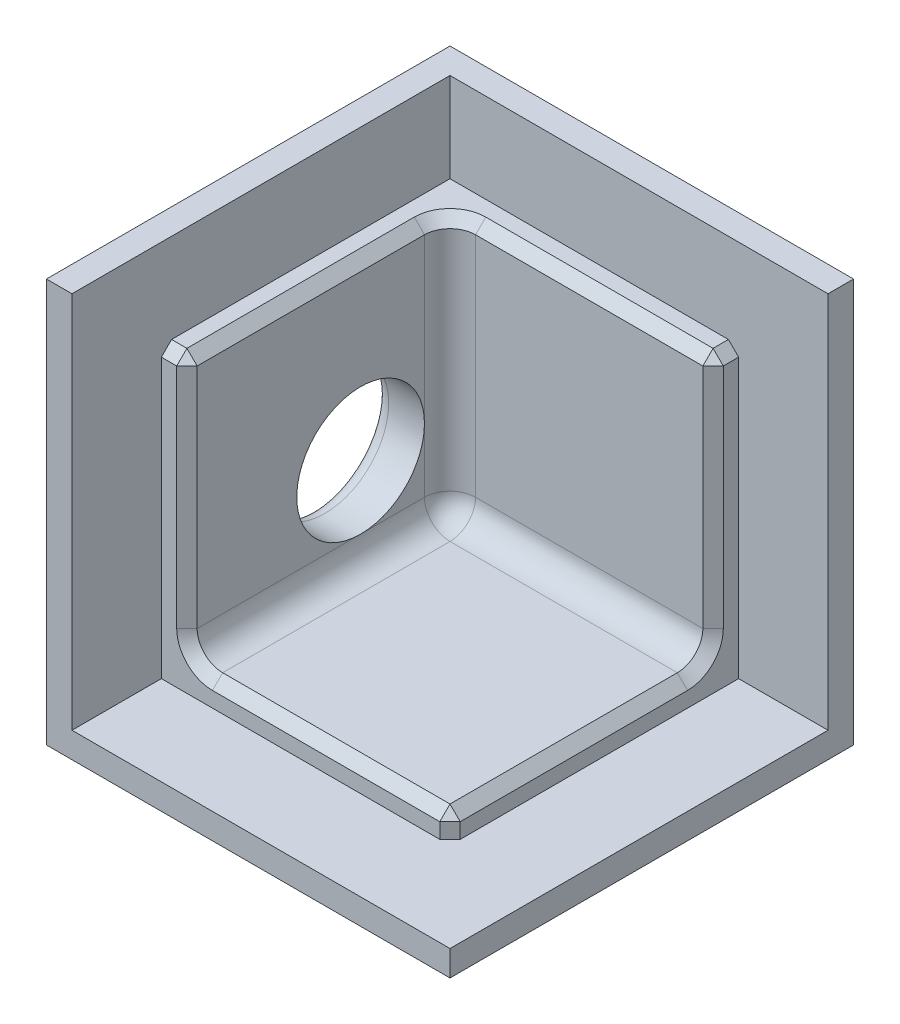
ISO-10303-21;
HEADER;
FILE_DESCRIPTION(('STEP AP214'),'2;1');
FILE_NAME('part.step','',(''),(''),'','','');
FILE_SCHEMA(('AUTOMOTIVE_DESIGN { 1 0 10303 214 1 1 1 1 }'));
ENDSEC;
DATA;
#1=APPLICATION_CONTEXT('core data for automotive mechanical design processes');
#2=APPLICATION_PROTOCOL_DEFINITION('international standard','automotive_design',2000,#1);
#3=PRODUCT_CONTEXT('',#1,'mechanical');
#4=PRODUCT('Part','Part','',(#3));
#5=PRODUCT_RELATED_PRODUCT_CATEGORY('part','',(#4));
#6=PRODUCT_DEFINITION_FORMATION('','',#4);
#7=PRODUCT_DEFINITION_CONTEXT('part definition',#1,'design');
#8=PRODUCT_DEFINITION('design','',#6,#7);
#9=PRODUCT_DEFINITION_SHAPE('','',#8);
#10=(LENGTH_UNIT() NAMED_UNIT(*) SI_UNIT(.MILLI.,.METRE.));
#11=(NAMED_UNIT(*) PLANE_ANGLE_UNIT() SI_UNIT($,.RADIAN.));
#12=(NAMED_UNIT(*) SI_UNIT($,.STERADIAN.) SOLID_ANGLE_UNIT());
#13=UNCERTAINTY_MEASURE_WITH_UNIT(LENGTH_MEASURE(1.E-05),#10,'distance_accuracy_value','');
#14=(GEOMETRIC_REPRESENTATION_CONTEXT(3) GLOBAL_UNCERTAINTY_ASSIGNED_CONTEXT((#13)) GLOBAL_UNIT_ASSIGNED_CONTEXT((#10,
#11,#12)) REPRESENTATION_CONTEXT('',''));
#15=CARTESIAN_POINT('',(0.,0.,0.));
#16=DIRECTION('',(0.,0.,1.));
#17=DIRECTION('',(1.,0.,0.));
#18=AXIS2_PLACEMENT_3D('',#15,#16,#17);
#19=CARTESIAN_POINT('',(-80.3971607088882,12.4102657004831,-7.89999999999997));
#20=DIRECTION('',(1.,0.,0.));
#21=DIRECTION('',(0.,0.,-1.));
#22=AXIS2_PLACEMENT_3D('',#19,#20,#21);
#23=PLANE('',#22);
#24=CARTESIAN_POINT('',(-80.3971607088882,2.1102657004831,-2.39999999999998));
#25=DIRECTION('',(1.,0.,0.));
#26=DIRECTION('',(0.,0.,-1.));
#27=AXIS2_PLACEMENT_3D('',#24,#25,#26);
#28=CIRCLE('',#27,2.5);
#29=CARTESIAN_POINT('',(-80.3971607088882,-0.389734299516903,-2.39999999999998));
#30=VERTEX_POINT('',#29);
#31=CARTESIAN_POINT('',(-80.3971607088882,2.1102657004831,-4.89999999999998));
#32=VERTEX_POINT('',#31);
#33=EDGE_CURVE('E48',#30,#32,#28,.F.);
#34=ORIENTED_EDGE('',*,*,#33,.T.);
#35=DIRECTION('',(0.,-1.,0.));
#36=VECTOR('',#35,1.);
#37=CARTESIAN_POINT('',(-80.3971607088882,8.9102657004831,-4.89999999999998));
#38=LINE('',#37,#36);
#39=CARTESIAN_POINT('',(-80.3971607088882,8.51026570048309,-4.89999999999998));
#40=VERTEX_POINT('',#39);
#41=EDGE_CURVE('E203',#32,#40,#38,.F.);
#42=ORIENTED_EDGE('',*,*,#41,.T.);
#43=DIRECTION('',(0.,0.,1.));
#44=VECTOR('',#43,1.);
#45=CARTESIAN_POINT('',(-80.3971607088882,8.51026570048309,4.40000000000003));
#46=LINE('',#45,#44);
#47=CARTESIAN_POINT('',(-80.3971607088882,8.51026570048309,4.00000000000002));
#48=VERTEX_POINT('',#47);
#49=EDGE_CURVE('E277',#40,#48,#46,.T.);
#50=ORIENTED_EDGE('',*,*,#49,.T.);
#51=DIRECTION('',(0.,-1.,0.));
#52=VECTOR('',#51,1.);
#53=CARTESIAN_POINT('',(-80.3971607088882,12.4102657004831,4.00000000000002));
#54=LINE('',#53,#52);
#55=CARTESIAN_POINT('',(-80.3971607088882,-0.389734299516903,4.00000000000002));
#56=VERTEX_POINT('',#55);
#57=EDGE_CURVE('E279',#48,#56,#54,.T.);
#58=ORIENTED_EDGE('',*,*,#57,.T.);
#59=DIRECTION('',(0.,0.,1.));
#60=VECTOR('',#59,1.);
#61=CARTESIAN_POINT('',(-80.3971607088882,-0.389734299516903,-5.89999999999998));
#62=LINE('',#61,#60);
#63=EDGE_CURVE('E206',#56,#30,#62,.F.);
#64=ORIENTED_EDGE('',*,*,#63,.T.);
#65=EDGE_LOOP('',(#34,#42,#50,#58,#64));
#66=FACE_BOUND('',#65,.T.);
#67=ADVANCED_FACE('F34',(#66),#23,.T.);
#68=CARTESIAN_POINT('',(-66.5971607088882,12.4102657004831,-7.89999999999997));
#69=DIRECTION('',(-1.,0.,0.));
#70=DIRECTION('',(0.,0.,1.));
#71=AXIS2_PLACEMENT_3D('',#68,#69,#70);
#72=PLANE('',#71);
#73=DIRECTION('',(0.,1.,0.));
#74=VECTOR('',#73,1.);
#75=CARTESIAN_POINT('',(-66.5971607088882,8.9102657004831,-6.89999999999998));
#76=LINE('',#75,#74);
#77=CARTESIAN_POINT('',(-66.5971607088882,-2.3897342995169,-6.89999999999998));
#78=VERTEX_POINT('',#77);
#79=CARTESIAN_POINT('',(-66.5971607088882,12.4102657004831,-6.89999999999998));
#80=VERTEX_POINT('',#79);
#81=EDGE_CURVE('E538',#78,#80,#76,.T.);
#82=ORIENTED_EDGE('',*,*,#81,.F.);
#83=DIRECTION('',(0.,0.,1.));
#84=VECTOR('',#83,1.);
#85=CARTESIAN_POINT('',(-66.5971607088882,-2.3897342995169,4.40000000000003));
#86=LINE('',#85,#84);
#87=CARTESIAN_POINT('',(-66.5971607088882,-2.3897342995169,7.90000000000003));
#88=VERTEX_POINT('',#87);
#89=EDGE_CURVE('E555',#78,#88,#86,.T.);
#90=ORIENTED_EDGE('',*,*,#89,.T.);
#91=DIRECTION('',(0.,-1.,0.));
#92=VECTOR('',#91,1.);
#93=CARTESIAN_POINT('',(-66.5971607088882,12.4102657004831,7.90000000000003));
#94=LINE('',#93,#92);
#95=CARTESIAN_POINT('',(-66.5971607088882,-3.3897342995169,7.90000000000003));
#96=VERTEX_POINT('',#95);
#97=EDGE_CURVE('E572',#88,#96,#94,.T.);
#98=ORIENTED_EDGE('',*,*,#97,.T.);
#99=DIRECTION('',(0.,0.,-1.));
#100=VECTOR('',#99,1.);
#101=CARTESIAN_POINT('',(-66.5971607088882,-3.3897342995169,-7.89999999999997));
#102=LINE('',#101,#100);
#103=CARTESIAN_POINT('',(-66.5971607088882,-3.3897342995169,-7.89999999999997));
#104=VERTEX_POINT('',#103);
#105=EDGE_CURVE('E558',#96,#104,#102,.T.);
#106=ORIENTED_EDGE('',*,*,#105,.T.);
#107=DIRECTION('',(0.,-1.,0.));
#108=VECTOR('',#107,1.);
#109=CARTESIAN_POINT('',(-66.5971607088882,12.4102657004831,-7.89999999999997));
#110=LINE('',#109,#108);
#111=CARTESIAN_POINT('',(-66.5971607088882,12.4102657004831,-7.89999999999997));
#112=VERTEX_POINT('',#111);
#113=EDGE_CURVE('E588',#112,#104,#110,.T.);
#114=ORIENTED_EDGE('',*,*,#113,.F.);
#115=DIRECTION('',(0.,0.,-1.));
#116=VECTOR('',#115,1.);
#117=CARTESIAN_POINT('',(-66.5971607088882,12.4102657004831,-7.89999999999997));
#118=LINE('',#117,#116);
#119=EDGE_CURVE('E562',#80,#112,#118,.T.);
#120=ORIENTED_EDGE('',*,*,#119,.F.);
#121=EDGE_LOOP('',(#82,#90,#98,#106,#114,#120));
#122=FACE_BOUND('',#121,.T.);
#123=ADVANCED_FACE('F346',(#122),#72,.F.);
#124=EDGE_CURVE('E193',#32,#30,#28,.F.);
#125=ORIENTED_EDGE('',*,*,#124,.T.);
#126=CARTESIAN_POINT('',(-80.3971607088882,-0.389734299516903,-4.89999999999998));
#127=VERTEX_POINT('',#126);
#128=EDGE_CURVE('E219',#30,#127,#62,.F.);
#129=ORIENTED_EDGE('',*,*,#128,.T.);
#130=EDGE_CURVE('E212',#127,#32,#38,.F.);
#131=ORIENTED_EDGE('',*,*,#130,.T.);
#132=EDGE_LOOP('',(#125,#129,#131));
#133=FACE_BOUND('',#132,.T.);
#134=ADVANCED_FACE('F218',(#133),#23,.T.);
#135=CARTESIAN_POINT('',(-74.4971607088882,-1.3897342995169,0.));
#136=DIRECTION('',(0.,1.,0.));
#137=DIRECTION('',(0.,0.,1.));
#138=AXIS2_PLACEMENT_3D('',#135,#136,#137);
#139=PLANE('',#138);
#140=DIRECTION('',(0.,0.,1.));
#141=VECTOR('',#140,1.);
#142=CARTESIAN_POINT('',(-79.3971607088882,-1.3897342995169,4.40000000000003));
#143=LINE('',#142,#141);
#144=CARTESIAN_POINT('',(-79.3971607088882,-1.3897342995169,-4.89999999999998));
#145=VERTEX_POINT('',#144);
#146=CARTESIAN_POINT('',(-79.3971607088882,-1.3897342995169,4.00000000000002));
#147=VERTEX_POINT('',#146);
#148=EDGE_CURVE('E221',#145,#147,#143,.T.);
#149=ORIENTED_EDGE('',*,*,#148,.T.);
#150=DIRECTION('',(1.,0.,0.));
#151=VECTOR('',#150,1.);
#152=CARTESIAN_POINT('',(-74.4971607088882,-1.3897342995169,4.00000000000002));
#153=LINE('',#152,#151);
#154=CARTESIAN_POINT('',(-70.4971607088882,-1.3897342995169,4.00000000000002));
#155=VERTEX_POINT('',#154);
#156=EDGE_CURVE('E262',#147,#155,#153,.T.);
#157=ORIENTED_EDGE('',*,*,#156,.T.);
#158=DIRECTION('',(0.,0.,-1.));
#159=VECTOR('',#158,1.);
#160=CARTESIAN_POINT('',(-70.4971607088882,-1.3897342995169,-4.89999999999998));
#161=LINE('',#160,#159);
#162=CARTESIAN_POINT('',(-70.4971607088882,-1.3897342995169,-4.89999999999998));
#163=VERTEX_POINT('',#162);
#164=EDGE_CURVE('E260',#155,#163,#161,.T.);
#165=ORIENTED_EDGE('',*,*,#164,.T.);
#166=DIRECTION('',(-1.,0.,0.));
#167=VECTOR('',#166,1.);
#168=CARTESIAN_POINT('',(-80.3971607088882,-1.3897342995169,-4.89999999999998));
#169=LINE('',#168,#167);
#170=EDGE_CURVE('E223',#163,#145,#169,.T.);
#171=ORIENTED_EDGE('',*,*,#170,.T.);
#172=EDGE_LOOP('',(#149,#157,#165,#171));
#173=FACE_BOUND('',#172,.T.);
#174=ADVANCED_FACE('F356',(#173),#139,.T.);
#175=CARTESIAN_POINT('',(-82.3971607088882,12.4102657004831,7.90000000000003));
#176=DIRECTION('',(0.,0.,-1.));
#177=DIRECTION('',(-1.,0.,0.));
#178=AXIS2_PLACEMENT_3D('',#175,#176,#177);
#179=PLANE('',#178);
#180=ORIENTED_EDGE('',*,*,#97,.F.);
#181=DIRECTION('',(1.,0.,0.));
#182=VECTOR('',#181,1.);
#183=CARTESIAN_POINT('',(-81.3971607088882,-2.3897342995169,7.90000000000003));
#184=LINE('',#183,#182);
#185=CARTESIAN_POINT('',(-81.3971607088882,-2.3897342995169,7.90000000000003));
#186=VERTEX_POINT('',#185);
#187=EDGE_CURVE('E548',#186,#88,#184,.T.);
#188=ORIENTED_EDGE('',*,*,#187,.F.);
#189=DIRECTION('',(0.,-1.,0.));
#190=VECTOR('',#189,1.);
#191=CARTESIAN_POINT('',(-81.3971607088882,12.4102657004831,7.90000000000003));
#192=LINE('',#191,#190);
#193=CARTESIAN_POINT('',(-81.3971607088882,12.4102657004831,7.90000000000003));
#194=VERTEX_POINT('',#193);
#195=EDGE_CURVE('E543',#194,#186,#192,.T.);
#196=ORIENTED_EDGE('',*,*,#195,.F.);
#197=DIRECTION('',(1.,0.,0.));
#198=VECTOR('',#197,1.);
#199=CARTESIAN_POINT('',(-82.3971607088882,12.4102657004831,7.90000000000003));
#200=LINE('',#199,#198);
#201=CARTESIAN_POINT('',(-82.3971607088882,12.4102657004831,7.90000000000003));
#202=VERTEX_POINT('',#201);
#203=EDGE_CURVE('E569',#202,#194,#200,.T.);
#204=ORIENTED_EDGE('',*,*,#203,.F.);
#205=DIRECTION('',(0.,-1.,0.));
#206=VECTOR('',#205,1.);
#207=CARTESIAN_POINT('',(-82.3971607088882,12.4102657004831,7.90000000000003));
#208=LINE('',#207,#206);
#209=CARTESIAN_POINT('',(-82.3971607088882,-3.3897342995169,7.90000000000003));
#210=VERTEX_POINT('',#209);
#211=EDGE_CURVE('E582',#202,#210,#208,.T.);
#212=ORIENTED_EDGE('',*,*,#211,.T.);
#213=DIRECTION('',(1.,0.,0.));
#214=VECTOR('',#213,1.);
#215=CARTESIAN_POINT('',(-82.3971607088882,-3.3897342995169,7.90000000000003));
#216=LINE('',#215,#214);
#217=EDGE_CURVE('E565',#210,#96,#216,.T.);
#218=ORIENTED_EDGE('',*,*,#217,.T.);
#219=EDGE_LOOP('',(#180,#188,#196,#204,#212,#218));
#220=FACE_BOUND('',#219,.T.);
#221=ADVANCED_FACE('F360',(#220),#179,.F.);
#222=CARTESIAN_POINT('',(-82.3971607088882,12.4102657004831,-7.89999999999997));
#223=DIRECTION('',(0.,0.,1.));
#224=DIRECTION('',(1.,0.,0.));
#225=AXIS2_PLACEMENT_3D('',#222,#223,#224);
#226=PLANE('',#225);
#227=DIRECTION('',(-1.,0.,0.));
#228=VECTOR('',#227,1.);
#229=CARTESIAN_POINT('',(-82.3971607088882,-3.3897342995169,-7.89999999999997));
#230=LINE('',#229,#228);
#231=CARTESIAN_POINT('',(-82.3971607088882,-3.3897342995169,-7.89999999999997));
#232=VERTEX_POINT('',#231);
#233=EDGE_CURVE('E575',#104,#232,#230,.T.);
#234=ORIENTED_EDGE('',*,*,#233,.T.);
#235=DIRECTION('',(0.,-1.,0.));
#236=VECTOR('',#235,1.);
#237=CARTESIAN_POINT('',(-82.3971607088882,12.4102657004831,-7.89999999999997));
#238=LINE('',#237,#236);
#239=CARTESIAN_POINT('',(-82.3971607088882,12.4102657004831,-7.89999999999997));
#240=VERTEX_POINT('',#239);
#241=EDGE_CURVE('E585',#240,#232,#238,.T.);
#242=ORIENTED_EDGE('',*,*,#241,.F.);
#243=DIRECTION('',(-1.,0.,0.));
#244=VECTOR('',#243,1.);
#245=CARTESIAN_POINT('',(-82.3971607088882,12.4102657004831,-7.89999999999997));
#246=LINE('',#245,#244);
#247=EDGE_CURVE('E564',#112,#240,#246,.T.);
#248=ORIENTED_EDGE('',*,*,#247,.F.);
#249=ORIENTED_EDGE('',*,*,#113,.T.);
#250=EDGE_LOOP('',(#234,#242,#248,#249));
#251=FACE_BOUND('',#250,.T.);
#252=ADVANCED_FACE('F365',(#251),#226,.F.);
#253=CARTESIAN_POINT('',(-82.3971607088882,12.4102657004831,-7.89999999999997));
#254=DIRECTION('',(1.,0.,0.));
#255=DIRECTION('',(0.,0.,-1.));
#256=AXIS2_PLACEMENT_3D('',#253,#254,#255);
#257=PLANE('',#256);
#258=CARTESIAN_POINT('',(-82.3971607088882,2.1102657004831,-2.39999999999998));
#259=DIRECTION('',(1.,0.,0.));
#260=DIRECTION('',(0.,0.,-1.));
#261=AXIS2_PLACEMENT_3D('',#258,#259,#260);
#262=CIRCLE('',#261,3.1);
#263=CARTESIAN_POINT('',(-82.3971607088882,2.1102657004831,-5.49999999999998));
#264=VERTEX_POINT('',#263);
#265=EDGE_CURVE('E11',#264,#264,#262,.T.);
#266=ORIENTED_EDGE('',*,*,#265,.T.);
#267=EDGE_LOOP('',(#266));
#268=FACE_BOUND('',#267,.T.);
#269=DIRECTION('',(0.,0.,1.));
#270=VECTOR('',#269,1.);
#271=CARTESIAN_POINT('',(-82.3971607088882,-3.3897342995169,-7.89999999999997));
#272=LINE('',#271,#270);
#273=EDGE_CURVE('E577',#232,#210,#272,.T.);
#274=ORIENTED_EDGE('',*,*,#273,.T.);
#275=ORIENTED_EDGE('',*,*,#211,.F.);
#276=DIRECTION('',(0.,0.,1.));
#277=VECTOR('',#276,1.);
#278=CARTESIAN_POINT('',(-82.3971607088882,12.4102657004831,-7.89999999999997));
#279=LINE('',#278,#277);
#280=EDGE_CURVE('E567',#240,#202,#279,.T.);
#281=ORIENTED_EDGE('',*,*,#280,.F.);
#282=ORIENTED_EDGE('',*,*,#241,.T.);
#283=EDGE_LOOP('',(#274,#275,#281,#282));
#284=FACE_BOUND('',#283,.T.);
#285=ADVANCED_FACE('F373',(#268,#284),#257,.F.);
#286=CARTESIAN_POINT('',(-74.4971607088882,12.4102657004831,0.));
#287=DIRECTION('',(0.,1.,0.));
#288=DIRECTION('',(0.,0.,1.));
#289=AXIS2_PLACEMENT_3D('',#286,#287,#288);
#290=PLANE('',#289);
#291=DIRECTION('',(0.,0.,1.));
#292=VECTOR('',#291,1.);
#293=CARTESIAN_POINT('',(-81.3971607088882,12.4102657004831,4.40000000000003));
#294=LINE('',#293,#292);
#295=CARTESIAN_POINT('',(-81.3971607088882,12.4102657004831,-6.89999999999998));
#296=VERTEX_POINT('',#295);
#297=EDGE_CURVE('E551',#296,#194,#294,.T.);
#298=ORIENTED_EDGE('',*,*,#297,.F.);
#299=DIRECTION('',(-1.,0.,0.));
#300=VECTOR('',#299,1.);
#301=CARTESIAN_POINT('',(-81.3971607088882,12.4102657004831,-6.89999999999998));
#302=LINE('',#301,#300);
#303=EDGE_CURVE('E531',#80,#296,#302,.T.);
#304=ORIENTED_EDGE('',*,*,#303,.F.);
#305=ORIENTED_EDGE('',*,*,#119,.T.);
#306=ORIENTED_EDGE('',*,*,#247,.T.);
#307=ORIENTED_EDGE('',*,*,#280,.T.);
#308=ORIENTED_EDGE('',*,*,#203,.T.);
#309=EDGE_LOOP('',(#298,#304,#305,#306,#307,#308));
#310=FACE_BOUND('',#309,.T.);
#311=ADVANCED_FACE('F369',(#310),#290,.T.);
#312=CARTESIAN_POINT('',(-74.4971607088882,-3.3897342995169,0.));
#313=DIRECTION('',(0.,1.,0.));
#314=DIRECTION('',(0.,0.,1.));
#315=AXIS2_PLACEMENT_3D('',#312,#313,#314);
#316=PLANE('',#315);
#317=ORIENTED_EDGE('',*,*,#105,.F.);
#318=ORIENTED_EDGE('',*,*,#217,.F.);
#319=ORIENTED_EDGE('',*,*,#273,.F.);
#320=ORIENTED_EDGE('',*,*,#233,.F.);
#321=EDGE_LOOP('',(#317,#318,#319,#320));
#322=FACE_BOUND('',#321,.T.);
#323=ADVANCED_FACE('F372',(#322),#316,.F.);
#324=CARTESIAN_POINT('',(-82.3971607088882,12.4102657004831,-5.89999999999998));
#325=DIRECTION('',(0.,0.,1.));
#326=DIRECTION('',(1.,0.,0.));
#327=AXIS2_PLACEMENT_3D('',#324,#325,#326);
#328=PLANE('',#327);
#329=DIRECTION('',(-1.,0.,0.));
#330=VECTOR('',#329,1.);
#331=CARTESIAN_POINT('',(-70.0971607088882,-0.389734299516903,-5.89999999999998));
#332=LINE('',#331,#330);
#333=CARTESIAN_POINT('',(-79.3971607088882,-0.389734299516903,-5.89999999999998));
#334=VERTEX_POINT('',#333);
#335=CARTESIAN_POINT('',(-70.4971607088882,-0.389734299516903,-5.89999999999998));
#336=VERTEX_POINT('',#335);
#337=EDGE_CURVE('E591',#334,#336,#332,.F.);
#338=ORIENTED_EDGE('',*,*,#337,.T.);
#339=DIRECTION('',(0.,1.,0.));
#340=VECTOR('',#339,1.);
#341=CARTESIAN_POINT('',(-70.4971607088882,8.9102657004831,-5.89999999999998));
#342=LINE('',#341,#340);
#343=CARTESIAN_POINT('',(-70.4971607088882,8.51026570048309,-5.89999999999998));
#344=VERTEX_POINT('',#343);
#345=EDGE_CURVE('E56',#336,#344,#342,.T.);
#346=ORIENTED_EDGE('',*,*,#345,.T.);
#347=DIRECTION('',(-1.,0.,0.));
#348=VECTOR('',#347,1.);
#349=CARTESIAN_POINT('',(-79.3971607088882,8.51026570048309,-5.89999999999998));
#350=LINE('',#349,#348);
#351=CARTESIAN_POINT('',(-79.3971607088882,8.51026570048309,-5.89999999999998));
#352=VERTEX_POINT('',#351);
#353=EDGE_CURVE('E284',#344,#352,#350,.T.);
#354=ORIENTED_EDGE('',*,*,#353,.T.);
#355=DIRECTION('',(0.,-1.,0.));
#356=VECTOR('',#355,1.);
#357=CARTESIAN_POINT('',(-79.3971607088882,-1.3897342995169,-5.89999999999998));
#358=LINE('',#357,#356);
#359=EDGE_CURVE('E592',#352,#334,#358,.T.);
#360=ORIENTED_EDGE('',*,*,#359,.T.);
#361=EDGE_LOOP('',(#338,#346,#354,#360));
#362=FACE_BOUND('',#361,.T.);
#363=ADVANCED_FACE('F376',(#362),#328,.T.);
#364=CARTESIAN_POINT('',(-81.3971607088882,-2.3897342995169,4.40000000000003));
#365=DIRECTION('',(0.,-1.,0.));
#366=DIRECTION('',(0.,0.,-1.));
#367=AXIS2_PLACEMENT_3D('',#364,#365,#366);
#368=PLANE('',#367);
#369=ORIENTED_EDGE('',*,*,#187,.T.);
#370=ORIENTED_EDGE('',*,*,#89,.F.);
#371=DIRECTION('',(-1.,0.,0.));
#372=VECTOR('',#371,1.);
#373=CARTESIAN_POINT('',(-15.1391572594028,-2.3897342995169,-6.89999999999999));
#374=LINE('',#373,#372);
#375=CARTESIAN_POINT('',(-70.0971607088882,-2.3897342995169,-6.89999999999997));
#376=VERTEX_POINT('',#375);
#377=EDGE_CURVE('E529',#78,#376,#374,.T.);
#378=ORIENTED_EDGE('',*,*,#377,.T.);
#379=DIRECTION('',(0.,0.,1.));
#380=VECTOR('',#379,1.);
#381=CARTESIAN_POINT('',(-70.0971607088882,-2.3897342995169,4.40000000000003));
#382=LINE('',#381,#380);
#383=CARTESIAN_POINT('',(-70.0971607088882,-2.3897342995169,4.00000000000002));
#384=VERTEX_POINT('',#383);
#385=EDGE_CURVE('E239',#376,#384,#382,.T.);
#386=ORIENTED_EDGE('',*,*,#385,.T.);
#387=DIRECTION('',(-0.707106781186544,0.,0.707106781186551));
#388=VECTOR('',#387,1.);
#389=CARTESIAN_POINT('',(-75.9471607088881,-2.3897342995169,9.85000000000003));
#390=LINE('',#389,#388);
#391=CARTESIAN_POINT('',(-70.4971607088882,-2.3897342995169,4.40000000000003));
#392=VERTEX_POINT('',#391);
#393=EDGE_CURVE('E287',#384,#392,#390,.T.);
#394=ORIENTED_EDGE('',*,*,#393,.T.);
#395=DIRECTION('',(1.,0.,0.));
#396=VECTOR('',#395,1.);
#397=CARTESIAN_POINT('',(-81.3971607088882,-2.3897342995169,4.40000000000003));
#398=LINE('',#397,#396);
#399=CARTESIAN_POINT('',(-81.3971607088882,-2.3897342995169,4.40000000000003));
#400=VERTEX_POINT('',#399);
#401=EDGE_CURVE('E547',#400,#392,#398,.T.);
#402=ORIENTED_EDGE('',*,*,#401,.F.);
#403=DIRECTION('',(0.,0.,1.));
#404=VECTOR('',#403,1.);
#405=CARTESIAN_POINT('',(-81.3971607088882,-2.3897342995169,4.40000000000003));
#406=LINE('',#405,#404);
#407=EDGE_CURVE('E559',#400,#186,#406,.T.);
#408=ORIENTED_EDGE('',*,*,#407,.T.);
#409=EDGE_LOOP('',(#369,#370,#378,#386,#394,#402,#408));
#410=FACE_BOUND('',#409,.T.);
#411=ADVANCED_FACE('F608',(#410),#368,.F.);
#412=CARTESIAN_POINT('',(-81.3971607088882,12.4102657004831,4.40000000000003));
#413=DIRECTION('',(-1.,0.,0.));
#414=DIRECTION('',(0.,-1.,0.));
#415=AXIS2_PLACEMENT_3D('',#412,#413,#414);
#416=PLANE('',#415);
#417=ORIENTED_EDGE('',*,*,#195,.T.);
#418=ORIENTED_EDGE('',*,*,#407,.F.);
#419=DIRECTION('',(0.,-1.,0.));
#420=VECTOR('',#419,1.);
#421=CARTESIAN_POINT('',(-81.3971607088882,12.4102657004831,4.40000000000003));
#422=LINE('',#421,#420);
#423=CARTESIAN_POINT('',(-81.3971607088882,8.51026570048309,4.40000000000003));
#424=VERTEX_POINT('',#423);
#425=EDGE_CURVE('E545',#424,#400,#422,.T.);
#426=ORIENTED_EDGE('',*,*,#425,.F.);
#427=DIRECTION('',(0.,0.707106781186548,-0.707106781186548));
#428=VECTOR('',#427,1.);
#429=CARTESIAN_POINT('',(-81.3971607088882,10.4602657004831,2.45000000000002));
#430=LINE('',#429,#428);
#431=CARTESIAN_POINT('',(-81.3971607088882,8.9102657004831,4.00000000000002));
#432=VERTEX_POINT('',#431);
#433=EDGE_CURVE('E289',#424,#432,#430,.T.);
#434=ORIENTED_EDGE('',*,*,#433,.T.);
#435=DIRECTION('',(0.,0.,1.));
#436=VECTOR('',#435,1.);
#437=CARTESIAN_POINT('',(-81.3971607088882,8.9102657004831,4.40000000000003));
#438=LINE('',#437,#436);
#439=CARTESIAN_POINT('',(-81.3971607088882,8.9102657004831,-6.89999999999998));
#440=VERTEX_POINT('',#439);
#441=EDGE_CURVE('E536',#440,#432,#438,.T.);
#442=ORIENTED_EDGE('',*,*,#441,.F.);
#443=DIRECTION('',(0.,1.,0.));
#444=VECTOR('',#443,1.);
#445=CARTESIAN_POINT('',(-81.3971607088882,8.9102657004831,-6.89999999999998));
#446=LINE('',#445,#444);
#447=EDGE_CURVE('E540',#440,#296,#446,.T.);
#448=ORIENTED_EDGE('',*,*,#447,.T.);
#449=ORIENTED_EDGE('',*,*,#297,.T.);
#450=EDGE_LOOP('',(#417,#418,#426,#434,#442,#448,#449));
#451=FACE_BOUND('',#450,.T.);
#452=ADVANCED_FACE('F620',(#451),#416,.F.);
#453=CARTESIAN_POINT('',(-74.4971607088882,-3.3897342995169,4.40000000000003));
#454=DIRECTION('',(0.,0.,1.));
#455=DIRECTION('',(1.,0.,0.));
#456=AXIS2_PLACEMENT_3D('',#453,#454,#455);
#457=PLANE('',#456);
#458=ORIENTED_EDGE('',*,*,#401,.T.);
#459=DIRECTION('',(0.,1.,0.));
#460=VECTOR('',#459,1.);
#461=CARTESIAN_POINT('',(-70.4971607088882,-1.3897342995169,4.40000000000003));
#462=LINE('',#461,#460);
#463=CARTESIAN_POINT('',(-70.4971607088882,-1.78973429951691,4.40000000000003));
#464=VERTEX_POINT('',#463);
#465=EDGE_CURVE('E247',#392,#464,#462,.T.);
#466=ORIENTED_EDGE('',*,*,#465,.T.);
#467=DIRECTION('',(-1.,0.,0.));
#468=VECTOR('',#467,1.);
#469=CARTESIAN_POINT('',(-74.4971607088882,-1.78973429951691,4.40000000000003));
#470=LINE('',#469,#468);
#471=CARTESIAN_POINT('',(-79.3971607088882,-1.78973429951691,4.40000000000003));
#472=VERTEX_POINT('',#471);
#473=EDGE_CURVE('E245',#464,#472,#470,.T.);
#474=ORIENTED_EDGE('',*,*,#473,.T.);
#475=CARTESIAN_POINT('',(-79.3971607088882,-0.389734299516903,4.40000000000003));
#476=DIRECTION('',(0.,0.,1.));
#477=DIRECTION('',(1.,0.,0.));
#478=AXIS2_PLACEMENT_3D('',#475,#476,#477);
#479=CIRCLE('',#478,1.4);
#480=CARTESIAN_POINT('',(-80.7971607088882,-0.389734299516903,4.40000000000003));
#481=VERTEX_POINT('',#480);
#482=EDGE_CURVE('E243',#472,#481,#479,.F.);
#483=ORIENTED_EDGE('',*,*,#482,.T.);
#484=DIRECTION('',(0.,1.,0.));
#485=VECTOR('',#484,1.);
#486=CARTESIAN_POINT('',(-80.7971607088882,-3.3897342995169,4.40000000000003));
#487=LINE('',#486,#485);
#488=CARTESIAN_POINT('',(-80.7971607088882,8.51026570048309,4.40000000000003));
#489=VERTEX_POINT('',#488);
#490=EDGE_CURVE('E229',#481,#489,#487,.T.);
#491=ORIENTED_EDGE('',*,*,#490,.T.);
#492=DIRECTION('',(-1.,0.,0.));
#493=VECTOR('',#492,1.);
#494=CARTESIAN_POINT('',(-81.3971607088882,8.51026570048309,4.40000000000003));
#495=LINE('',#494,#493);
#496=EDGE_CURVE('E241',#489,#424,#495,.T.);
#497=ORIENTED_EDGE('',*,*,#496,.T.);
#498=ORIENTED_EDGE('',*,*,#425,.T.);
#499=EDGE_LOOP('',(#458,#466,#474,#483,#491,#497,#498));
#500=FACE_BOUND('',#499,.T.);
#501=ADVANCED_FACE('F612',(#500),#457,.T.);
#502=CARTESIAN_POINT('',(-81.3971607088882,8.9102657004831,-6.89999999999998));
#503=DIRECTION('',(0.,0.,-1.));
#504=DIRECTION('',(-1.,0.,0.));
#505=AXIS2_PLACEMENT_3D('',#502,#503,#504);
#506=PLANE('',#505);
#507=ORIENTED_EDGE('',*,*,#303,.T.);
#508=ORIENTED_EDGE('',*,*,#447,.F.);
#509=DIRECTION('',(-1.,0.,0.));
#510=VECTOR('',#509,1.);
#511=CARTESIAN_POINT('',(-81.3971607088882,8.9102657004831,-6.89999999999998));
#512=LINE('',#511,#510);
#513=CARTESIAN_POINT('',(-70.4971607088882,8.9102657004831,-6.89999999999998));
#514=VERTEX_POINT('',#513);
#515=EDGE_CURVE('E525',#514,#440,#512,.T.);
#516=ORIENTED_EDGE('',*,*,#515,.F.);
#517=DIRECTION('',(-0.707106781186548,0.707106781186548,0.));
#518=VECTOR('',#517,1.);
#519=CARTESIAN_POINT('',(-75.9471607088882,14.3602657004831,-6.89999999999998));
#520=LINE('',#519,#518);
#521=CARTESIAN_POINT('',(-70.0971607088882,8.51026570048309,-6.89999999999997));
#522=VERTEX_POINT('',#521);
#523=EDGE_CURVE('E291',#514,#522,#520,.F.);
#524=ORIENTED_EDGE('',*,*,#523,.T.);
#525=DIRECTION('',(0.,-1.,0.));
#526=VECTOR('',#525,1.);
#527=CARTESIAN_POINT('',(-70.0971607088882,-2.3897342995169,-6.89999999999997));
#528=LINE('',#527,#526);
#529=EDGE_CURVE('E522',#522,#376,#528,.T.);
#530=ORIENTED_EDGE('',*,*,#529,.T.);
#531=ORIENTED_EDGE('',*,*,#377,.F.);
#532=ORIENTED_EDGE('',*,*,#81,.T.);
#533=EDGE_LOOP('',(#507,#508,#516,#524,#530,#531,#532));
#534=FACE_BOUND('',#533,.T.);
#535=ADVANCED_FACE('F520',(#534),#506,.F.);
#536=CARTESIAN_POINT('',(-74.4971607088882,8.9102657004831,0.));
#537=DIRECTION('',(0.,-1.,0.));
#538=DIRECTION('',(0.,0.,-1.));
#539=AXIS2_PLACEMENT_3D('',#536,#537,#538);
#540=PLANE('',#539);
#541=ORIENTED_EDGE('',*,*,#441,.T.);
#542=DIRECTION('',(1.,0.,0.));
#543=VECTOR('',#542,1.);
#544=CARTESIAN_POINT('',(-80.3971607088882,8.9102657004831,4.00000000000002));
#545=LINE('',#544,#543);
#546=CARTESIAN_POINT('',(-80.7971607088882,8.9102657004831,4.00000000000002));
#547=VERTEX_POINT('',#546);
#548=EDGE_CURVE('E275',#432,#547,#545,.T.);
#549=ORIENTED_EDGE('',*,*,#548,.T.);
#550=DIRECTION('',(0.,0.,-1.));
#551=VECTOR('',#550,1.);
#552=CARTESIAN_POINT('',(-80.7971607088882,8.9102657004831,-4.89999999999998));
#553=LINE('',#552,#551);
#554=CARTESIAN_POINT('',(-80.7971607088882,8.9102657004831,-4.89999999999998));
#555=VERTEX_POINT('',#554);
#556=EDGE_CURVE('E273',#547,#555,#553,.T.);
#557=ORIENTED_EDGE('',*,*,#556,.T.);
#558=CARTESIAN_POINT('',(-79.3971607088882,8.9102657004831,-4.89999999999998));
#559=DIRECTION('',(0.,-1.,0.));
#560=DIRECTION('',(0.,0.,-1.));
#561=AXIS2_PLACEMENT_3D('',#558,#559,#560);
#562=CIRCLE('',#561,1.4);
#563=CARTESIAN_POINT('',(-79.3971607088882,8.9102657004831,-6.29999999999998));
#564=VERTEX_POINT('',#563);
#565=EDGE_CURVE('E271',#555,#564,#562,.T.);
#566=ORIENTED_EDGE('',*,*,#565,.T.);
#567=DIRECTION('',(1.,0.,0.));
#568=VECTOR('',#567,1.);
#569=CARTESIAN_POINT('',(-70.0971607088882,8.9102657004831,-6.29999999999998));
#570=LINE('',#569,#568);
#571=CARTESIAN_POINT('',(-70.4971607088882,8.9102657004831,-6.29999999999998));
#572=VERTEX_POINT('',#571);
#573=EDGE_CURVE('E267',#564,#572,#570,.T.);
#574=ORIENTED_EDGE('',*,*,#573,.T.);
#575=DIRECTION('',(0.,0.,-1.));
#576=VECTOR('',#575,1.);
#577=CARTESIAN_POINT('',(-70.4971607088882,8.9102657004831,0.));
#578=LINE('',#577,#576);
#579=EDGE_CURVE('E269',#572,#514,#578,.T.);
#580=ORIENTED_EDGE('',*,*,#579,.T.);
#581=ORIENTED_EDGE('',*,*,#515,.T.);
#582=EDGE_LOOP('',(#541,#549,#557,#566,#574,#580,#581));
#583=FACE_BOUND('',#582,.T.);
#584=ADVANCED_FACE('F511',(#583),#540,.F.);
#585=CARTESIAN_POINT('',(-70.0971607088882,12.4102657004831,-7.89999999999997));
#586=DIRECTION('',(-1.,0.,0.));
#587=DIRECTION('',(0.,0.,1.));
#588=AXIS2_PLACEMENT_3D('',#585,#586,#587);
#589=PLANE('',#588);
#590=DIRECTION('',(0.,0.,1.));
#591=VECTOR('',#590,1.);
#592=CARTESIAN_POINT('',(-70.0971607088882,-1.78973429951691,4.40000000000003));
#593=LINE('',#592,#591);
#594=CARTESIAN_POINT('',(-70.0971607088882,-1.78973429951691,-4.89999999999998));
#595=VERTEX_POINT('',#594);
#596=CARTESIAN_POINT('',(-70.0971607088882,-1.78973429951691,4.00000000000002));
#597=VERTEX_POINT('',#596);
#598=EDGE_CURVE('E256',#595,#597,#593,.T.);
#599=ORIENTED_EDGE('',*,*,#598,.T.);
#600=DIRECTION('',(0.,-1.,0.));
#601=VECTOR('',#600,1.);
#602=CARTESIAN_POINT('',(-70.0971607088882,-2.3897342995169,4.00000000000002));
#603=LINE('',#602,#601);
#604=EDGE_CURVE('E258',#597,#384,#603,.T.);
#605=ORIENTED_EDGE('',*,*,#604,.T.);
#606=ORIENTED_EDGE('',*,*,#385,.F.);
#607=ORIENTED_EDGE('',*,*,#529,.F.);
#608=DIRECTION('',(0.,0.,1.));
#609=VECTOR('',#608,1.);
#610=CARTESIAN_POINT('',(-70.0971607088882,8.51026570048309,-7.89999999999997));
#611=LINE('',#610,#609);
#612=CARTESIAN_POINT('',(-70.0971607088882,8.51026570048309,-6.29999999999998));
#613=VERTEX_POINT('',#612);
#614=EDGE_CURVE('E252',#522,#613,#611,.T.);
#615=ORIENTED_EDGE('',*,*,#614,.T.);
#616=DIRECTION('',(0.,-1.,0.));
#617=VECTOR('',#616,1.);
#618=CARTESIAN_POINT('',(-70.0971607088882,-0.389734299516904,-6.29999999999998));
#619=LINE('',#618,#617);
#620=CARTESIAN_POINT('',(-70.0971607088882,-0.389734299516903,-6.29999999999998));
#621=VERTEX_POINT('',#620);
#622=EDGE_CURVE('E250',#613,#621,#619,.T.);
#623=ORIENTED_EDGE('',*,*,#622,.T.);
#624=CARTESIAN_POINT('',(-70.0971607088882,-0.389734299516903,-4.89999999999998));
#625=DIRECTION('',(-1.,0.,0.));
#626=DIRECTION('',(0.,0.,1.));
#627=AXIS2_PLACEMENT_3D('',#624,#625,#626);
#628=CIRCLE('',#627,1.4);
#629=EDGE_CURVE('E254',#621,#595,#628,.T.);
#630=ORIENTED_EDGE('',*,*,#629,.T.);
#631=EDGE_LOOP('',(#599,#605,#606,#607,#615,#623,#630));
#632=FACE_BOUND('',#631,.T.);
#633=ADVANCED_FACE('F399',(#632),#589,.F.);
#634=CARTESIAN_POINT('',(-74.4971607088882,-0.389734299516903,-4.89999999999998));
#635=DIRECTION('',(1.,0.,0.));
#636=DIRECTION('',(0.,0.,-1.));
#637=AXIS2_PLACEMENT_3D('',#634,#635,#636);
#638=CYLINDRICAL_SURFACE('',#637,1.);
#639=ORIENTED_EDGE('',*,*,#170,.F.);
#640=CARTESIAN_POINT('',(-70.4971607088882,-0.389734299516903,-4.89999999999998));
#641=DIRECTION('',(-1.,0.,0.));
#642=DIRECTION('',(0.,0.,1.));
#643=AXIS2_PLACEMENT_3D('',#640,#641,#642);
#644=CIRCLE('',#643,1.);
#645=EDGE_CURVE('E281',#163,#336,#644,.F.);
#646=ORIENTED_EDGE('',*,*,#645,.T.);
#647=ORIENTED_EDGE('',*,*,#337,.F.);
#648=CARTESIAN_POINT('',(-79.3971607088882,-0.389734299516903,-4.89999999999998));
#649=DIRECTION('',(1.,0.,0.));
#650=DIRECTION('',(0.,0.,-1.));
#651=AXIS2_PLACEMENT_3D('',#648,#649,#650);
#652=CIRCLE('',#651,1.);
#653=EDGE_CURVE('E236',#145,#334,#652,.T.);
#654=ORIENTED_EDGE('',*,*,#653,.F.);
#655=EDGE_LOOP('',(#639,#646,#647,#654));
#656=FACE_BOUND('',#655,.T.);
#657=ADVANCED_FACE('F395',(#656),#638,.F.);
#658=CARTESIAN_POINT('',(-79.3971607088882,-0.389734299516903,0.));
#659=DIRECTION('',(0.,0.,-1.));
#660=DIRECTION('',(-1.,0.,0.));
#661=AXIS2_PLACEMENT_3D('',#658,#659,#660);
#662=CYLINDRICAL_SURFACE('',#661,1.);
#663=ORIENTED_EDGE('',*,*,#63,.F.);
#664=CARTESIAN_POINT('',(-79.3971607088882,-0.389734299516903,4.00000000000002));
#665=DIRECTION('',(0.,0.,1.));
#666=DIRECTION('',(1.,0.,0.));
#667=AXIS2_PLACEMENT_3D('',#664,#665,#666);
#668=CIRCLE('',#667,1.);
#669=EDGE_CURVE('E265',#56,#147,#668,.T.);
#670=ORIENTED_EDGE('',*,*,#669,.T.);
#671=ORIENTED_EDGE('',*,*,#148,.F.);
#672=CARTESIAN_POINT('',(-79.3971607088882,-0.389734299516903,-4.89999999999998));
#673=DIRECTION('',(0.,0.,1.));
#674=DIRECTION('',(1.,0.,0.));
#675=AXIS2_PLACEMENT_3D('',#672,#673,#674);
#676=CIRCLE('',#675,1.);
#677=EDGE_CURVE('E232',#127,#145,#676,.T.);
#678=ORIENTED_EDGE('',*,*,#677,.F.);
#679=ORIENTED_EDGE('',*,*,#128,.F.);
#680=EDGE_LOOP('',(#663,#670,#671,#678,#679));
#681=FACE_BOUND('',#680,.T.);
#682=ADVANCED_FACE('F391',(#681),#662,.F.);
#683=CARTESIAN_POINT('',(-79.3971607088882,-0.389734299516903,-4.89999999999998));
#684=DIRECTION('',(0.,0.,1.));
#685=DIRECTION('',(1.,0.,0.));
#686=AXIS2_PLACEMENT_3D('',#683,#684,#685);
#687=SPHERICAL_SURFACE('',#686,1.);
#688=ORIENTED_EDGE('',*,*,#677,.T.);
#689=ORIENTED_EDGE('',*,*,#653,.T.);
#690=CARTESIAN_POINT('',(-79.3971607088882,-0.389734299516903,-4.89999999999998));
#691=DIRECTION('',(0.,1.,0.));
#692=DIRECTION('',(0.,0.,1.));
#693=AXIS2_PLACEMENT_3D('',#690,#691,#692);
#694=CIRCLE('',#693,1.);
#695=EDGE_CURVE('E230',#127,#334,#694,.F.);
#696=ORIENTED_EDGE('',*,*,#695,.F.);
#697=EDGE_LOOP('',(#688,#689,#696));
#698=FACE_BOUND('',#697,.T.);
#699=ADVANCED_FACE('F388',(#698),#687,.F.);
#700=CARTESIAN_POINT('',(-79.3971607088882,12.4102657004831,-4.89999999999998));
#701=DIRECTION('',(0.,1.,0.));
#702=DIRECTION('',(0.,0.,1.));
#703=AXIS2_PLACEMENT_3D('',#700,#701,#702);
#704=CYLINDRICAL_SURFACE('',#703,1.);
#705=ORIENTED_EDGE('',*,*,#359,.F.);
#706=CARTESIAN_POINT('',(-79.3971607088882,8.51026570048309,-4.89999999999998));
#707=DIRECTION('',(0.,-1.,0.));
#708=DIRECTION('',(0.,0.,-1.));
#709=AXIS2_PLACEMENT_3D('',#706,#707,#708);
#710=CIRCLE('',#709,1.);
#711=EDGE_CURVE('E215',#352,#40,#710,.F.);
#712=ORIENTED_EDGE('',*,*,#711,.T.);
#713=ORIENTED_EDGE('',*,*,#41,.F.);
#714=ORIENTED_EDGE('',*,*,#130,.F.);
#715=ORIENTED_EDGE('',*,*,#695,.T.);
#716=EDGE_LOOP('',(#705,#712,#713,#714,#715));
#717=FACE_BOUND('',#716,.T.);
#718=ADVANCED_FACE('F210',(#717),#704,.F.);
#719=CARTESIAN_POINT('',(-79.3971607088882,8.9102657004831,-4.89999999999998));
#720=DIRECTION('',(0.,1.,0.));
#721=DIRECTION('',(0.,0.,1.));
#722=AXIS2_PLACEMENT_3D('',#719,#720,#721);
#723=CONICAL_SURFACE('',#722,1.4,0.785398163397448);
#724=DIRECTION('',(0.,-0.707106781186547,0.707106781186547));
#725=VECTOR('',#724,1.);
#726=CARTESIAN_POINT('',(-79.3971607088882,8.9102657004831,-6.29999999999998));
#727=LINE('',#726,#725);
#728=EDGE_CURVE('E329',#564,#352,#727,.T.);
#729=ORIENTED_EDGE('',*,*,#728,.F.);
#730=ORIENTED_EDGE('',*,*,#565,.F.);
#731=DIRECTION('',(-0.707106781186547,0.707106781186547,0.));
#732=VECTOR('',#731,1.);
#733=CARTESIAN_POINT('',(-80.3971607088882,8.51026570048309,-4.89999999999998));
#734=LINE('',#733,#732);
#735=EDGE_CURVE('E233',#40,#555,#734,.T.);
#736=ORIENTED_EDGE('',*,*,#735,.F.);
#737=ORIENTED_EDGE('',*,*,#711,.F.);
#738=EDGE_LOOP('',(#729,#730,#736,#737));
#739=FACE_BOUND('',#738,.T.);
#740=ADVANCED_FACE('F387',(#739),#723,.F.);
#741=CARTESIAN_POINT('',(-74.4971607088882,8.9102657004831,4.00000000000002));
#742=DIRECTION('',(0.,0.707106781186547,0.707106781186547));
#743=DIRECTION('',(-1.,0.,0.));
#744=AXIS2_PLACEMENT_3D('',#741,#742,#743);
#745=PLANE('',#744);
#746=ORIENTED_EDGE('',*,*,#433,.F.);
#747=ORIENTED_EDGE('',*,*,#496,.F.);
#748=DIRECTION('',(0.,-0.707106781186547,0.707106781186547));
#749=VECTOR('',#748,1.);
#750=CARTESIAN_POINT('',(-80.7971607088882,8.9102657004831,4.00000000000002));
#751=LINE('',#750,#749);
#752=EDGE_CURVE('E326',#547,#489,#751,.T.);
#753=ORIENTED_EDGE('',*,*,#752,.F.);
#754=ORIENTED_EDGE('',*,*,#548,.F.);
#755=EDGE_LOOP('',(#746,#747,#753,#754));
#756=FACE_BOUND('',#755,.T.);
#757=ADVANCED_FACE('F491',(#756),#745,.T.);
#758=CARTESIAN_POINT('',(-80.7971607088882,8.9102657004831,0.));
#759=DIRECTION('',(0.707106781186547,0.707106781186547,0.));
#760=DIRECTION('',(0.,0.,1.));
#761=AXIS2_PLACEMENT_3D('',#758,#759,#760);
#762=PLANE('',#761);
#763=ORIENTED_EDGE('',*,*,#735,.T.);
#764=ORIENTED_EDGE('',*,*,#556,.F.);
#765=DIRECTION('',(-0.707106781186547,0.707106781186547,0.));
#766=VECTOR('',#765,1.);
#767=CARTESIAN_POINT('',(-80.7971607088882,8.9102657004831,4.00000000000002));
#768=LINE('',#767,#766);
#769=EDGE_CURVE('E323',#48,#547,#768,.T.);
#770=ORIENTED_EDGE('',*,*,#769,.F.);
#771=ORIENTED_EDGE('',*,*,#49,.F.);
#772=EDGE_LOOP('',(#763,#764,#770,#771));
#773=FACE_BOUND('',#772,.T.);
#774=ADVANCED_FACE('F484',(#773),#762,.T.);
#775=CARTESIAN_POINT('',(-74.4971607088882,8.9102657004831,-6.29999999999998));
#776=DIRECTION('',(0.,0.707106781186547,0.707106781186547));
#777=DIRECTION('',(-1.,0.,0.));
#778=AXIS2_PLACEMENT_3D('',#775,#776,#777);
#779=PLANE('',#778);
#780=ORIENTED_EDGE('',*,*,#728,.T.);
#781=ORIENTED_EDGE('',*,*,#353,.F.);
#782=DIRECTION('',(0.,-0.707106781186547,0.707106781186547));
#783=VECTOR('',#782,1.);
#784=CARTESIAN_POINT('',(-70.4971607088882,8.7102657004831,-6.09999999999998));
#785=LINE('',#784,#783);
#786=EDGE_CURVE('E320',#572,#344,#785,.T.);
#787=ORIENTED_EDGE('',*,*,#786,.F.);
#788=ORIENTED_EDGE('',*,*,#573,.F.);
#789=EDGE_LOOP('',(#780,#781,#787,#788));
#790=FACE_BOUND('',#789,.T.);
#791=ADVANCED_FACE('F477',(#790),#779,.T.);
#792=CARTESIAN_POINT('',(-70.4971607088882,8.9102657004831,0.));
#793=DIRECTION('',(-0.707106781186547,-0.707106781186547,0.));
#794=DIRECTION('',(0.,0.,-1.));
#795=AXIS2_PLACEMENT_3D('',#792,#793,#794);
#796=PLANE('',#795);
#797=ORIENTED_EDGE('',*,*,#523,.F.);
#798=ORIENTED_EDGE('',*,*,#579,.F.);
#799=DIRECTION('',(0.707106781186547,-0.707106781186547,0.));
#800=VECTOR('',#799,1.);
#801=CARTESIAN_POINT('',(-70.0971607088882,8.51026570048309,-6.29999999999998));
#802=LINE('',#801,#800);
#803=EDGE_CURVE('E317',#613,#572,#802,.F.);
#804=ORIENTED_EDGE('',*,*,#803,.F.);
#805=ORIENTED_EDGE('',*,*,#614,.F.);
#806=EDGE_LOOP('',(#797,#798,#804,#805));
#807=FACE_BOUND('',#806,.T.);
#808=ADVANCED_FACE('F470',(#807),#796,.F.);
#809=CARTESIAN_POINT('',(-80.7971607088882,8.9102657004831,4.00000000000002));
#810=DIRECTION('',(0.577350269189626,0.577350269189626,0.577350269189626));
#811=DIRECTION('',(0.707106781186547,0.,-0.707106781186547));
#812=AXIS2_PLACEMENT_3D('',#809,#810,#811);
#813=PLANE('',#812);
#814=ORIENTED_EDGE('',*,*,#769,.T.);
#815=ORIENTED_EDGE('',*,*,#752,.T.);
#816=DIRECTION('',(-0.707106781186547,0.,0.707106781186547));
#817=VECTOR('',#816,1.);
#818=CARTESIAN_POINT('',(-80.5971607088882,8.51026570048309,4.20000000000002));
#819=LINE('',#818,#817);
#820=EDGE_CURVE('E314',#48,#489,#819,.T.);
#821=ORIENTED_EDGE('',*,*,#820,.F.);
#822=EDGE_LOOP('',(#814,#815,#821));
#823=FACE_BOUND('',#822,.T.);
#824=ADVANCED_FACE('F463',(#823),#813,.T.);
#825=CARTESIAN_POINT('',(-70.0971607088882,8.51026570048309,-6.29999999999998));
#826=DIRECTION('',(0.577350269189626,0.577350269189626,0.577350269189626));
#827=DIRECTION('',(0.707106781186547,0.,-0.707106781186547));
#828=AXIS2_PLACEMENT_3D('',#825,#826,#827);
#829=PLANE('',#828);
#830=ORIENTED_EDGE('',*,*,#803,.T.);
#831=ORIENTED_EDGE('',*,*,#786,.T.);
#832=DIRECTION('',(0.707106781186547,0.,-0.707106781186547));
#833=VECTOR('',#832,1.);
#834=CARTESIAN_POINT('',(-70.0971607088882,8.51026570048309,-6.29999999999998));
#835=LINE('',#834,#833);
#836=EDGE_CURVE('E311',#613,#344,#835,.F.);
#837=ORIENTED_EDGE('',*,*,#836,.F.);
#838=EDGE_LOOP('',(#830,#831,#837));
#839=FACE_BOUND('',#838,.T.);
#840=ADVANCED_FACE('F456',(#839),#829,.T.);
#841=CARTESIAN_POINT('',(-80.3971607088882,12.4102657004831,4.00000000000002));
#842=DIRECTION('',(-0.707106781186547,0.,-0.707106781186547));
#843=DIRECTION('',(0.,-1.,0.));
#844=AXIS2_PLACEMENT_3D('',#841,#842,#843);
#845=PLANE('',#844);
#846=ORIENTED_EDGE('',*,*,#820,.T.);
#847=ORIENTED_EDGE('',*,*,#490,.F.);
#848=DIRECTION('',(-0.707106781186547,0.,0.707106781186547));
#849=VECTOR('',#848,1.);
#850=CARTESIAN_POINT('',(-80.3971607088882,-0.389734299516903,4.00000000000002));
#851=LINE('',#850,#849);
#852=EDGE_CURVE('E308',#56,#481,#851,.T.);
#853=ORIENTED_EDGE('',*,*,#852,.F.);
#854=ORIENTED_EDGE('',*,*,#57,.F.);
#855=EDGE_LOOP('',(#846,#847,#853,#854));
#856=FACE_BOUND('',#855,.T.);
#857=ADVANCED_FACE('F449',(#856),#845,.F.);
#858=CARTESIAN_POINT('',(-70.4971607088882,12.4102657004831,-5.89999999999998));
#859=DIRECTION('',(0.707106781186547,0.,0.707106781186547));
#860=DIRECTION('',(0.,-1.,0.));
#861=AXIS2_PLACEMENT_3D('',#858,#859,#860);
#862=PLANE('',#861);
#863=ORIENTED_EDGE('',*,*,#836,.T.);
#864=ORIENTED_EDGE('',*,*,#345,.F.);
#865=DIRECTION('',(-0.707106781186547,0.,0.707106781186547));
#866=VECTOR('',#865,1.);
#867=CARTESIAN_POINT('',(-70.0971607088882,-0.389734299516903,-6.29999999999998));
#868=LINE('',#867,#866);
#869=EDGE_CURVE('E305',#621,#336,#868,.T.);
#870=ORIENTED_EDGE('',*,*,#869,.F.);
#871=ORIENTED_EDGE('',*,*,#622,.F.);
#872=EDGE_LOOP('',(#863,#864,#870,#871));
#873=FACE_BOUND('',#872,.T.);
#874=ADVANCED_FACE('F442',(#873),#862,.T.);
#875=CARTESIAN_POINT('',(-79.3971607088882,-0.389734299516903,4.40000000000003));
#876=DIRECTION('',(0.,0.,1.));
#877=DIRECTION('',(1.,0.,0.));
#878=AXIS2_PLACEMENT_3D('',#875,#876,#877);
#879=CONICAL_SURFACE('',#878,1.4,0.785398163397448);
#880=ORIENTED_EDGE('',*,*,#852,.T.);
#881=ORIENTED_EDGE('',*,*,#482,.F.);
#882=DIRECTION('',(0.,-0.707106781186547,0.707106781186547));
#883=VECTOR('',#882,1.);
#884=CARTESIAN_POINT('',(-79.3971607088882,-1.3897342995169,4.00000000000002));
#885=LINE('',#884,#883);
#886=EDGE_CURVE('E302',#147,#472,#885,.T.);
#887=ORIENTED_EDGE('',*,*,#886,.F.);
#888=ORIENTED_EDGE('',*,*,#669,.F.);
#889=EDGE_LOOP('',(#880,#881,#887,#888));
#890=FACE_BOUND('',#889,.T.);
#891=ADVANCED_FACE('F435',(#890),#879,.F.);
#892=CARTESIAN_POINT('',(-70.0971607088882,-0.389734299516903,-4.89999999999998));
#893=DIRECTION('',(1.,0.,0.));
#894=DIRECTION('',(0.,0.,-1.));
#895=AXIS2_PLACEMENT_3D('',#892,#893,#894);
#896=CONICAL_SURFACE('',#895,1.4,0.785398163397448);
#897=ORIENTED_EDGE('',*,*,#869,.T.);
#898=ORIENTED_EDGE('',*,*,#645,.F.);
#899=DIRECTION('',(-0.707106781186548,0.707106781186547,0.));
#900=VECTOR('',#899,1.);
#901=CARTESIAN_POINT('',(-70.0971607088882,-1.78973429951691,-4.89999999999998));
#902=LINE('',#901,#900);
#903=EDGE_CURVE('E299',#595,#163,#902,.T.);
#904=ORIENTED_EDGE('',*,*,#903,.F.);
#905=ORIENTED_EDGE('',*,*,#629,.F.);
#906=EDGE_LOOP('',(#897,#898,#904,#905));
#907=FACE_BOUND('',#906,.T.);
#908=ADVANCED_FACE('F428',(#907),#896,.F.);
#909=CARTESIAN_POINT('',(-74.4971607088882,-1.78973429951691,4.40000000000003));
#910=DIRECTION('',(0.,-0.707106781186544,-0.707106781186551));
#911=DIRECTION('',(-1.,0.,0.));
#912=AXIS2_PLACEMENT_3D('',#909,#910,#911);
#913=PLANE('',#912);
#914=ORIENTED_EDGE('',*,*,#886,.T.);
#915=ORIENTED_EDGE('',*,*,#473,.F.);
#916=DIRECTION('',(0.,0.707106781186551,-0.707106781186544));
#917=VECTOR('',#916,1.);
#918=CARTESIAN_POINT('',(-70.4971607088882,-1.78973429951691,4.40000000000003));
#919=LINE('',#918,#917);
#920=EDGE_CURVE('E296',#155,#464,#919,.F.);
#921=ORIENTED_EDGE('',*,*,#920,.F.);
#922=ORIENTED_EDGE('',*,*,#156,.F.);
#923=EDGE_LOOP('',(#914,#915,#921,#922));
#924=FACE_BOUND('',#923,.T.);
#925=ADVANCED_FACE('F421',(#924),#913,.F.);
#926=CARTESIAN_POINT('',(-70.4971607088882,-1.3897342995169,0.));
#927=DIRECTION('',(0.707106781186551,0.707106781186544,0.));
#928=DIRECTION('',(0.,0.,1.));
#929=AXIS2_PLACEMENT_3D('',#926,#927,#928);
#930=PLANE('',#929);
#931=ORIENTED_EDGE('',*,*,#903,.T.);
#932=ORIENTED_EDGE('',*,*,#164,.F.);
#933=DIRECTION('',(-0.707106781186545,0.707106781186551,0.));
#934=VECTOR('',#933,1.);
#935=CARTESIAN_POINT('',(-70.2971607088882,-1.58973429951691,4.00000000000002));
#936=LINE('',#935,#934);
#937=EDGE_CURVE('E294',#597,#155,#936,.T.);
#938=ORIENTED_EDGE('',*,*,#937,.F.);
#939=ORIENTED_EDGE('',*,*,#598,.F.);
#940=EDGE_LOOP('',(#931,#932,#938,#939));
#941=FACE_BOUND('',#940,.T.);
#942=ADVANCED_FACE('F414',(#941),#930,.T.);
#943=CARTESIAN_POINT('',(-70.4971607088882,-1.78973429951691,4.40000000000003));
#944=DIRECTION('',(0.577350269189631,0.577350269189621,0.577350269189626));
#945=DIRECTION('',(0.707106781186544,0.,-0.70710678118655));
#946=AXIS2_PLACEMENT_3D('',#943,#944,#945);
#947=PLANE('',#946);
#948=ORIENTED_EDGE('',*,*,#937,.T.);
#949=ORIENTED_EDGE('',*,*,#920,.T.);
#950=DIRECTION('',(0.707106781186545,0.,-0.707106781186551));
#951=VECTOR('',#950,1.);
#952=CARTESIAN_POINT('',(-70.4971607088882,-1.78973429951691,4.40000000000003));
#953=LINE('',#952,#951);
#954=EDGE_CURVE('E198',#597,#464,#953,.F.);
#955=ORIENTED_EDGE('',*,*,#954,.F.);
#956=EDGE_LOOP('',(#948,#949,#955));
#957=FACE_BOUND('',#956,.T.);
#958=ADVANCED_FACE('F407',(#957),#947,.T.);
#959=CARTESIAN_POINT('',(-70.4971607088882,-3.3897342995169,4.40000000000003));
#960=DIRECTION('',(0.707106781186551,0.,0.707106781186544));
#961=DIRECTION('',(0.,-1.,0.));
#962=AXIS2_PLACEMENT_3D('',#959,#960,#961);
#963=PLANE('',#962);
#964=ORIENTED_EDGE('',*,*,#393,.F.);
#965=ORIENTED_EDGE('',*,*,#604,.F.);
#966=ORIENTED_EDGE('',*,*,#954,.T.);
#967=ORIENTED_EDGE('',*,*,#465,.F.);
#968=EDGE_LOOP('',(#964,#965,#966,#967));
#969=FACE_BOUND('',#968,.T.);
#970=ADVANCED_FACE('F342',(#969),#963,.T.);
#971=CARTESIAN_POINT('',(-66.5961607088882,2.1102657004831,-2.39999999999998));
#972=DIRECTION('',(-1.,0.,0.));
#973=DIRECTION('',(0.,0.,1.));
#974=AXIS2_PLACEMENT_3D('',#971,#972,#973);
#975=CYLINDRICAL_SURFACE('',#974,2.5);
#976=CARTESIAN_POINT('',(-81.7971607088882,2.1102657004831,-2.39999999999998));
#977=DIRECTION('',(1.,0.,0.));
#978=DIRECTION('',(0.,0.,-1.));
#979=AXIS2_PLACEMENT_3D('',#976,#977,#978);
#980=CIRCLE('',#979,2.5);
#981=CARTESIAN_POINT('',(-81.7971607088882,2.1102657004831,-4.89999999999998));
#982=VERTEX_POINT('',#981);
#983=EDGE_CURVE('E42',#982,#982,#980,.F.);
#984=ORIENTED_EDGE('',*,*,#983,.T.);
#985=EDGE_LOOP('',(#984));
#986=FACE_BOUND('',#985,.T.);
#987=ORIENTED_EDGE('',*,*,#124,.F.);
#988=ORIENTED_EDGE('',*,*,#33,.F.);
#989=EDGE_LOOP('',(#987,#988));
#990=FACE_BOUND('',#989,.T.);
#991=ADVANCED_FACE('F194',(#986,#990),#975,.F.);
#992=CARTESIAN_POINT('',(-81.7971607088882,2.1102657004831,-2.39999999999998));
#993=DIRECTION('',(1.,0.,0.));
#994=DIRECTION('',(0.,0.,-1.));
#995=AXIS2_PLACEMENT_3D('',#992,#993,#994);
#996=TOROIDAL_SURFACE('',#995,3.1,0.6);
#997=ORIENTED_EDGE('',*,*,#265,.F.);
#998=EDGE_LOOP('',(#997));
#999=FACE_BOUND('',#998,.T.);
#1000=ORIENTED_EDGE('',*,*,#983,.F.);
#1001=EDGE_LOOP('',(#1000));
#1002=FACE_BOUND('',#1001,.T.);
#1003=ADVANCED_FACE('F36',(#999,#1002),#996,.T.);
#1004=CLOSED_SHELL('',(#67,#123,#134,#174,#221,#252,#285,#311,#323,#363,#411,#452,#501,#535,
#584,#633,#657,#682,#699,#718,#740,#757,#774,#791,#808,#824,#840,#857,#874,#891,#908,#925,#942,
#958,#970,#991,#1003));
#1005=MANIFOLD_SOLID_BREP('B2',#1004);
#1006=ADVANCED_BREP_SHAPE_REPRESENTATION('',(#18,#1005),#14);
#1007=SHAPE_DEFINITION_REPRESENTATION(#9,#1006);
ENDSEC;
END-ISO-10303-21;
